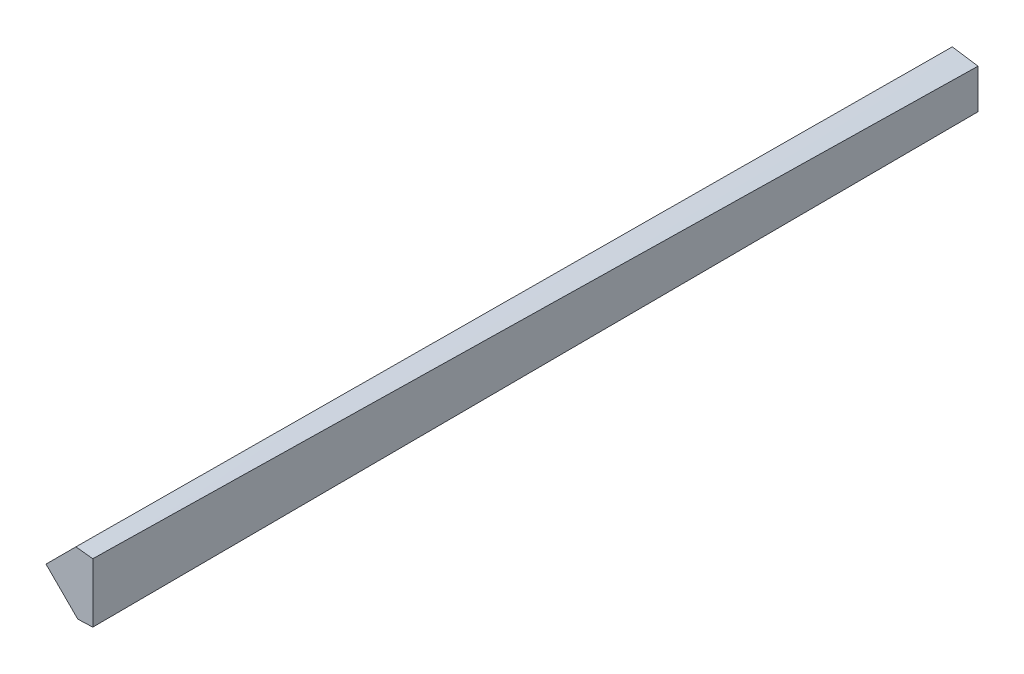
ISO-10303-21;
HEADER;
FILE_DESCRIPTION(('STEP AP214'),'2;1');
FILE_NAME('part.step','',(''),(''),'','','');
FILE_SCHEMA(('AUTOMOTIVE_DESIGN { 1 0 10303 214 1 1 1 1 }'));
ENDSEC;
DATA;
#1=APPLICATION_CONTEXT('core data for automotive mechanical design processes');
#2=APPLICATION_PROTOCOL_DEFINITION('international standard','automotive_design',2000,#1);
#3=PRODUCT_CONTEXT('',#1,'mechanical');
#4=PRODUCT('Part','Part','',(#3));
#5=PRODUCT_RELATED_PRODUCT_CATEGORY('part','',(#4));
#6=PRODUCT_DEFINITION_FORMATION('','',#4);
#7=PRODUCT_DEFINITION_CONTEXT('part definition',#1,'design');
#8=PRODUCT_DEFINITION('design','',#6,#7);
#9=PRODUCT_DEFINITION_SHAPE('','',#8);
#10=(LENGTH_UNIT() NAMED_UNIT(*) SI_UNIT(.MILLI.,.METRE.));
#11=(NAMED_UNIT(*) PLANE_ANGLE_UNIT() SI_UNIT($,.RADIAN.));
#12=(NAMED_UNIT(*) SI_UNIT($,.STERADIAN.) SOLID_ANGLE_UNIT());
#13=UNCERTAINTY_MEASURE_WITH_UNIT(LENGTH_MEASURE(1.E-05),#10,'distance_accuracy_value','');
#14=(GEOMETRIC_REPRESENTATION_CONTEXT(3) GLOBAL_UNCERTAINTY_ASSIGNED_CONTEXT((#13)) GLOBAL_UNIT_ASSIGNED_CONTEXT((#10,
#11,#12)) REPRESENTATION_CONTEXT('',''));
#15=CARTESIAN_POINT('',(0.,0.,0.));
#16=DIRECTION('',(0.,0.,1.));
#17=DIRECTION('',(1.,0.,0.));
#18=AXIS2_PLACEMENT_3D('',#15,#16,#17);
#19=CARTESIAN_POINT('',(175.085567987137,8.86155299316615,-679.45));
#20=DIRECTION('',(0.,0.,-1.));
#21=DIRECTION('',(-1.,0.,0.));
#22=AXIS2_PLACEMENT_3D('',#19,#20,#21);
#23=PLANE('',#22);
#24=DIRECTION('',(-0.707106781186546,0.707106781186549,0.));
#25=VECTOR('',#24,1.);
#26=CARTESIAN_POINT('',(143.493309988099,-2.65678052351673,-679.45));
#27=LINE('',#26,#25);
#28=CARTESIAN_POINT('',(143.493309988115,-2.65678052351616,-679.45));
#29=VERTEX_POINT('',#28);
#30=CARTESIAN_POINT('',(134.62015633349,6.21637313109208,-679.45));
#31=VERTEX_POINT('',#30);
#32=EDGE_CURVE('E295',#29,#31,#27,.T.);
#33=ORIENTED_EDGE('',*,*,#32,.T.);
#34=DIRECTION('',(0.707106781186545,0.70710678118655,0.));
#35=VECTOR('',#34,1.);
#36=CARTESIAN_POINT('',(134.62015633349,6.21637313109208,-679.45));
#37=LINE('',#36,#35);
#38=CARTESIAN_POINT('',(142.720808827515,14.3170256251169,-679.45));
#39=VERTEX_POINT('',#38);
#40=EDGE_CURVE('E165',#31,#39,#37,.T.);
#41=ORIENTED_EDGE('',*,*,#40,.T.);
#42=CARTESIAN_POINT('',(134.620156333493,15.4128451835555,-679.45));
#43=CARTESIAN_POINT('',(135.729716343512,15.2710557270873,-679.45));
#44=CARTESIAN_POINT('',(138.192823271289,14.9379110765184,-679.45));
#45=CARTESIAN_POINT('',(142.013236134128,14.4284933351529,-679.45));
#46=CARTESIAN_POINT('',(146.073742505185,13.8232141117196,-679.45));
#47=CARTESIAN_POINT('',(150.139605517909,13.2202668657995,-679.45));
#48=CARTESIAN_POINT('',(154.197683604887,12.5479467883236,-679.45));
#49=CARTESIAN_POINT('',(158.265560184403,11.9094790192579,-679.45));
#50=CARTESIAN_POINT('',(162.325264552697,11.2012187412181,-679.45));
#51=CARTESIAN_POINT('',(166.391523917957,10.4970471799216,-679.45));
#52=CARTESIAN_POINT('',(170.448647671062,9.72281472417865,-679.45));
#53=CARTESIAN_POINT('',(174.517448076692,8.98425337099883,-679.45));
#54=CARTESIAN_POINT('',(178.574031005431,8.16834190715938,-679.45));
#55=CARTESIAN_POINT('',(182.642660532388,7.3870883043623,-679.45));
#56=CARTESIAN_POINT('',(186.702108723553,6.53929151004852,-679.45));
#57=CARTESIAN_POINT('',(190.765256606112,5.68324855934698,-679.45));
#58=CARTESIAN_POINT('',(194.827790404657,4.80386244898524,-679.45));
#59=CARTESIAN_POINT('',(198.890203629623,3.90389487442927,-679.45));
#60=CARTESIAN_POINT('',(202.953557624183,2.98769437172212,-679.45));
#61=CARTESIAN_POINT('',(206.335025723878,2.1941886176228,-679.45));
#62=CARTESIAN_POINT('',(209.047708211878,1.57931571731317,-679.45));
#63=CARTESIAN_POINT('',(211.072202175627,1.07407382505783,-679.45));
#64=CARTESIAN_POINT('',(213.110075526926,0.618709231727971,-679.45));
#65=CARTESIAN_POINT('',(214.461627755124,0.287633140537885,-679.45));
#66=CARTESIAN_POINT('',(215.13815633349,0.121910771375219,-679.45));
#67=B_SPLINE_CURVE_WITH_KNOTS('',3,(#42,#43,#44,#45,#46,#47,#48,#49,#50,#51,#52,#53,#54,#55,#56,
#57,#58,#59,#60,#61,#62,#63,#64,#65,#66),.UNSPECIFIED.,.F.,.F.,(4,1,1,1,1,1,1,1,1,1,1,1,1,1,1,1,
1,1,1,1,1,1,4),(0.,0.00808012489399451,0.0179534857113933,0.0278404125043681,0.0377344781793459,
0.0476435308427544,0.0575525835061628,0.0674775651925868,0.0774108632477273,0.087361494814027,
0.0973121263803267,0.107281021733797,0.117249917087267,0.127238001400731,0.137236025479351,
0.147244218604062,0.157262809357627,0.16729202561187,0.17733209451514,0.182352128966774,
0.187383355312348,0.192403389763983,0.197434616109557),.UNSPECIFIED.);
#68=CARTESIAN_POINT('',(152.580668571194,12.8163867464822,-679.45));
#69=VERTEX_POINT('',#68);
#70=EDGE_CURVE('E207',#39,#69,#67,.T.);
#71=ORIENTED_EDGE('',*,*,#70,.T.);
#72=DIRECTION('',(0.,-1.,0.));
#73=VECTOR('',#72,1.);
#74=CARTESIAN_POINT('',(152.580668571201,12.8163867464811,-679.45));
#75=LINE('',#74,#73);
#76=CARTESIAN_POINT('',(152.580668571201,-2.33960397289713,-679.45));
#77=VERTEX_POINT('',#76);
#78=EDGE_CURVE('E90',#69,#77,#75,.T.);
#79=ORIENTED_EDGE('',*,*,#78,.T.);
#80=CARTESIAN_POINT('',(215.13784366651,-0.121910771375068,-679.45));
#81=CARTESIAN_POINT('',(214.460603955381,-0.15042090610083,-679.45));
#82=CARTESIAN_POINT('',(213.106361229738,-0.207431211204091,-679.45));
#83=CARTESIAN_POINT('',(211.073491525938,-0.251790953247334,-679.45));
#84=CARTESIAN_POINT('',(209.042065495297,-0.33902680049291,-679.45));
#85=CARTESIAN_POINT('',(206.333059407276,-0.443908014934658,-679.45));
#86=CARTESIAN_POINT('',(202.946202524654,-0.553563933266129,-679.45));
#87=CARTESIAN_POINT('',(198.881817483236,-0.683472120414775,-679.45));
#88=CARTESIAN_POINT('',(194.818916959679,-0.854412841729266,-679.45));
#89=CARTESIAN_POINT('',(190.754542770925,-0.984651069218046,-679.45));
#90=CARTESIAN_POINT('',(186.690169632013,-1.11492126417963,-679.45));
#91=CARTESIAN_POINT('',(182.627265958541,-1.28576607110368,-679.45));
#92=CARTESIAN_POINT('',(178.562892465175,-1.4160258944706,-679.45));
#93=CARTESIAN_POINT('',(174.498519694268,-1.54630560930904,-679.45));
#94=CARTESIAN_POINT('',(170.43561385315,-1.71709073436901,-679.45));
#95=CARTESIAN_POINT('',(166.371248661143,-1.84757973179484,-679.45));
#96=CARTESIAN_POINT('',(162.306844851464,-1.97700240521967,-679.45));
#97=CARTESIAN_POINT('',(158.244054877825,-2.15098690162749,-679.45));
#98=CARTESIAN_POINT('',(154.179003620324,-2.26954465119212,-679.45));
#99=CARTESIAN_POINT('',(150.116213646706,-2.44352914822967,-679.45));
#100=CARTESIAN_POINT('',(146.051809836945,-2.57295181913593,-679.45));
#101=CARTESIAN_POINT('',(141.987444645249,-2.70344082600662,-679.45));
#102=CARTESIAN_POINT('',(138.177778024242,-2.86358095260932,-679.45));
#103=CARTESIAN_POINT('',(135.721525160861,-2.9446052450096,-679.45));
#104=CARTESIAN_POINT('',(134.62015633349,-2.98009892137148,-679.45));
#105=B_SPLINE_CURVE_WITH_KNOTS('',3,(#80,#81,#82,#83,#84,#85,#86,#87,#88,#89,#90,#91,#92,#93,
#94,#95,#96,#97,#98,#99,#100,#101,#102,#103,#104),.UNSPECIFIED.,.F.,.F.,(4,1,1,1,1,1,1,1,1,1,1,
1,1,1,1,1,1,1,1,1,1,1,4),(0.806006040400567,0.810902253288598,0.815796754940576,
0.820692967828607,0.825589180716637,0.835379773174285,0.845170365631932,0.854962791407993,
0.864753383865641,0.874543976323288,0.884336402099349,0.894126994556997,0.903917587014645,
0.913710012790705,0.923500605248353,0.933291197706001,0.943083623482061,0.952874215939709,
0.96266664171577,0.972457234173417,0.982247826631065,0.992040252407126,1.),.UNSPECIFIED.);
#106=EDGE_CURVE('E13',#77,#29,#105,.T.);
#107=ORIENTED_EDGE('',*,*,#106,.T.);
#108=EDGE_LOOP('',(#33,#41,#71,#79,#107));
#109=FACE_BOUND('',#108,.T.);
#110=ADVANCED_FACE('F77',(#109),#23,.T.);
#111=CARTESIAN_POINT('',(194.174552360055,12.6206156116451,-339.598));
#112=DIRECTION('',(0.,0.,1.));
#113=DIRECTION('',(1.,0.,0.));
#114=AXIS2_PLACEMENT_3D('',#111,#112,#113);
#115=PLANE('',#114);
#116=DIRECTION('',(0.707106781186548,-0.707106781186547,0.));
#117=VECTOR('',#116,1.);
#118=CARTESIAN_POINT('',(146.823253439402,-3.99328842984262,-339.598));
#119=LINE('',#118,#117);
#120=CARTESIAN_POINT('',(134.62015633349,8.2098086760698,-339.598));
#121=VERTEX_POINT('',#120);
#122=CARTESIAN_POINT('',(146.823253439401,-3.99328842984267,-339.598));
#123=VERTEX_POINT('',#122);
#124=EDGE_CURVE('E133',#121,#123,#119,.T.);
#125=ORIENTED_EDGE('',*,*,#124,.T.);
#126=CARTESIAN_POINT('',(134.62015633349,-4.42595663658283,-339.598));
#127=CARTESIAN_POINT('',(137.849838696048,-4.30508085388316,-339.598));
#128=CARTESIAN_POINT('',(142.728131552134,-4.1684805846576,-339.598));
#129=CARTESIAN_POINT('',(149.250035994523,-3.889298345997,-339.598));
#130=CARTESIAN_POINT('',(154.191001353602,-3.72721013273353,-339.598));
#131=CARTESIAN_POINT('',(159.131965790657,-3.56509698090699,-339.598));
#132=CARTESIAN_POINT('',(164.07110969449,-3.35374269163561,-339.598));
#133=CARTESIAN_POINT('',(169.0120647307,-3.19137526907891,-339.598));
#134=CARTESIAN_POINT('',(173.953067694039,-3.03030416254037,-339.598));
#135=CARTESIAN_POINT('',(178.892067798534,-2.81506043973626,-339.598));
#136=CARTESIAN_POINT('',(183.833867842274,-2.66719729338293,-339.598));
#137=CARTESIAN_POINT('',(188.772867946794,-2.45195357134437,-339.598));
#138=CARTESIAN_POINT('',(193.713870910031,-2.29088246174404,-339.598));
#139=CARTESIAN_POINT('',(198.654825946627,-2.12851505066925,-339.598));
#140=CARTESIAN_POINT('',(203.593969849017,-1.91716071852693,-339.598));
#141=CARTESIAN_POINT('',(208.534934291454,-1.75504772667815,-339.598));
#142=CARTESIAN_POINT('',(213.475899630449,-1.59295891635564,-339.598));
#143=CARTESIAN_POINT('',(218.41504084283,-1.38153203057836,-339.598));
#144=CARTESIAN_POINT('',(223.356005741392,-1.2194306117671,-339.598));
#145=CARTESIAN_POINT('',(228.296971945599,-1.05736805505374,-339.598));
#146=CARTESIAN_POINT('',(233.236109240558,-0.845824568428618,-339.598));
#147=CARTESIAN_POINT('',(238.177088941397,-0.684163233910299,-339.598));
#148=CARTESIAN_POINT('',(242.294411906712,-0.547744685460737,-339.598));
#149=CARTESIAN_POINT('',(245.58767169763,-0.41775304433126,-339.598));
#150=CARTESIAN_POINT('',(248.057209266438,-0.309835009896686,-339.598));
#151=CARTESIAN_POINT('',(250.528541278363,-0.254040406195066,-339.598));
#152=CARTESIAN_POINT('',(252.174850508117,-0.18348941358549,-339.598));
#153=CARTESIAN_POINT('',(252.998148995216,-0.148207751775525,-339.598));
#154=B_SPLINE_CURVE_WITH_KNOTS('',3,(#126,#127,#128,#129,#130,#131,#132,#133,#134,#135,#136,
#137,#138,#139,#140,#141,#142,#143,#144,#145,#146,#147,#148,#149,#150,#151,#152,#153),
.UNSPECIFIED.,.F.,.F.,(4,1,1,1,1,1,1,1,1,1,1,1,1,1,1,1,1,1,1,1,1,1,1,1,1,4),(0.,
0.0192034583473541,0.0289958841234149,0.0387864765810626,0.0485770690387101,0.0583694948147709,
0.0681600872724186,0.0779506797300662,0.0877431055061269,0.0975336979637746,0.107326123739835,
0.117116716197483,0.126907308655131,0.136699734431191,0.146490326888839,0.156280919346487,
0.166073345122548,0.175863937580195,0.185654530037843,0.195446955813904,0.205237548271551,
0.215028140729199,0.219924353617229,0.22482056650526,0.229715068157238,0.234611281045269),.UNSPECIFIED.);
#155=CARTESIAN_POINT('',(152.580668575628,-3.78032082096611,-339.598));
#156=VERTEX_POINT('',#155);
#157=EDGE_CURVE('E175',#123,#156,#154,.T.);
#158=ORIENTED_EDGE('',*,*,#157,.T.);
#159=DIRECTION('',(0.,1.,0.));
#160=VECTOR('',#159,1.);
#161=CARTESIAN_POINT('',(152.580668575628,18.970302966159,-339.598));
#162=LINE('',#161,#160);
#163=CARTESIAN_POINT('',(152.580668575628,18.970302966159,-339.598));
#164=VERTEX_POINT('',#163);
#165=EDGE_CURVE('E250',#156,#164,#162,.T.);
#166=ORIENTED_EDGE('',*,*,#165,.T.);
#167=CARTESIAN_POINT('',(252.998226174907,0.148207751110273,-339.598));
#168=CARTESIAN_POINT('',(252.175614454486,0.34905628871512,-339.598));
#169=CARTESIAN_POINT('',(250.532220902123,0.750306579110062,-339.598));
#170=CARTESIAN_POINT('',(248.054348815467,1.30202503302794,-339.598));
#171=CARTESIAN_POINT('',(245.592696336244,1.91439188132001,-339.598));
#172=CARTESIAN_POINT('',(242.294308568737,2.65940598114388,-339.598));
#173=CARTESIAN_POINT('',(238.182710396525,3.62097107533648,-339.598));
#174=CARTESIAN_POINT('',(233.242027084944,4.73107086963747,-339.598));
#175=CARTESIAN_POINT('',(228.302502374574,5.82143706591983,-339.598));
#176=CARTESIAN_POINT('',(223.362849976669,6.88678215021274,-339.598));
#177=CARTESIAN_POINT('',(218.422472463154,7.92374826081143,-339.598));
#178=CARTESIAN_POINT('',(213.486600255424,8.95069286933694,-339.598));
#179=CARTESIAN_POINT('',(208.539627335117,9.89673211846371,-339.598));
#180=CARTESIAN_POINT('',(203.607267714716,10.884916182542,-339.598));
#181=CARTESIAN_POINT('',(198.660126249097,11.7790540678149,-339.598));
#182=CARTESIAN_POINT('',(193.727147408144,12.7165682318093,-339.598));
#183=CARTESIAN_POINT('',(188.783126670459,13.5689005872262,-339.598));
#184=CARTESIAN_POINT('',(183.847071125729,14.4262096361854,-339.598));
#185=CARTESIAN_POINT('',(178.901144649793,15.1986640387217,-339.598));
#186=CARTESIAN_POINT('',(173.967099178618,16.0122818775299,-339.598));
#187=CARTESIAN_POINT('',(169.023653216082,16.7415556296439,-339.598));
#188=CARTESIAN_POINT('',(164.086717211993,17.47366929745,-339.598));
#189=CARTESIAN_POINT('',(159.143636357812,18.1289860129173,-339.598));
#190=CARTESIAN_POINT('',(154.20811211871,18.7936793885843,-339.598));
#191=CARTESIAN_POINT('',(149.263879036725,19.3475018576684,-339.598));
#192=CARTESIAN_POINT('',(144.323994246415,19.89360071151,-339.598));
#193=CARTESIAN_POINT('',(139.446050656913,20.4252654930642,-339.598));
#194=CARTESIAN_POINT('',(136.208284585522,20.707376153436,-339.598));
#195=CARTESIAN_POINT('',(134.62015633349,20.8455739887224,-339.598));
#196=B_SPLINE_CURVE_WITH_KNOTS('',3,(#167,#168,#169,#170,#171,#172,#173,#174,#175,#176,#177,
#178,#179,#180,#181,#182,#183,#184,#185,#186,#187,#188,#189,#190,#191,#192,#193,#194,#195),
.UNSPECIFIED.,.F.,.F.,(4,1,1,1,1,1,1,1,1,1,1,1,1,1,1,1,1,1,1,1,1,1,1,1,1,1,4),
(0.761775692731026,0.7668069190766,0.771826953528235,0.776858179873809,0.781878214325443,
0.791918283228713,0.801947499482956,0.811966090236521,0.821974283361232,0.831972307439851,
0.841960391753315,0.851929287106786,0.861898182460256,0.871848814026556,0.881799445592856,
0.891732743647996,0.90165772533442,0.911566777997829,0.921475830661237,0.931369896336215,
0.94125682312919,0.951130183946588,0.960997118649047,0.97084620803462,0.980689828100494,
0.990528219086757,1.),.UNSPECIFIED.);
#197=CARTESIAN_POINT('',(146.10650302401,19.6961553665898,-339.598));
#198=VERTEX_POINT('',#197);
#199=EDGE_CURVE('E140',#164,#198,#196,.T.);
#200=ORIENTED_EDGE('',*,*,#199,.T.);
#201=DIRECTION('',(-0.707106781186547,-0.707106781186548,0.));
#202=VECTOR('',#201,1.);
#203=CARTESIAN_POINT('',(134.62015633349,8.2098086760698,-339.598));
#204=LINE('',#203,#202);
#205=EDGE_CURVE('E128',#198,#121,#204,.T.);
#206=ORIENTED_EDGE('',*,*,#205,.T.);
#207=EDGE_LOOP('',(#125,#158,#166,#200,#206));
#208=FACE_BOUND('',#207,.T.);
#209=ADVANCED_FACE('F132',(#208),#115,.T.);
#210=CARTESIAN_POINT('',(62.2081308441017,-62.2081308441013,0.364887948904961));
#211=DIRECTION('',(0.707100699218374,-0.70710069921837,0.00414756914098022));
#212=DIRECTION('',(0.707106781186545,0.70710678118655,0.));
#213=AXIS2_PLACEMENT_3D('',#210,#211,#212);
#214=PLANE('',#213);
#215=DIRECTION('',(-0.00996051883881494,-0.0158250922903294,-0.999825161975065));
#216=VECTOR('',#215,1.);
#217=CARTESIAN_POINT('',(146.10650302401,19.6961553665898,-339.598));
#218=LINE('',#217,#216);
#219=EDGE_CURVE('E167',#198,#39,#218,.T.);
#220=ORIENTED_EDGE('',*,*,#219,.T.);
#221=ORIENTED_EDGE('',*,*,#40,.F.);
#222=DIRECTION('',(0.,-0.00586549808015555,-0.999982797818178));
#223=VECTOR('',#222,1.);
#224=CARTESIAN_POINT('',(134.62015633349,8.2098086760698,-339.598));
#225=LINE('',#224,#223);
#226=EDGE_CURVE('E155',#121,#31,#225,.T.);
#227=ORIENTED_EDGE('',*,*,#226,.F.);
#228=ORIENTED_EDGE('',*,*,#205,.F.);
#229=EDGE_LOOP('',(#220,#221,#227,#228));
#230=FACE_BOUND('',#229,.T.);
#231=ADVANCED_FACE('F159',(#230),#214,.F.);
#232=CARTESIAN_POINT('',(72.4097097090649,72.4097097090647,-0.424726319502524));
#233=DIRECTION('',(0.707100699218373,0.707100699218371,-0.00414756914098059));
#234=DIRECTION('',(-0.707106781186546,0.707106781186549,0.));
#235=AXIS2_PLACEMENT_3D('',#232,#233,#234);
#236=PLANE('',#235);
#237=ORIENTED_EDGE('',*,*,#226,.T.);
#238=ORIENTED_EDGE('',*,*,#32,.F.);
#239=DIRECTION('',(-0.00979767037277226,0.00393239828494281,-0.999944269396547));
#240=VECTOR('',#239,1.);
#241=CARTESIAN_POINT('',(145.158281713758,-3.32503447667941,-509.524));
#242=LINE('',#241,#240);
#243=EDGE_CURVE('E152',#123,#29,#242,.T.);
#244=ORIENTED_EDGE('',*,*,#243,.F.);
#245=ORIENTED_EDGE('',*,*,#124,.F.);
#246=EDGE_LOOP('',(#237,#238,#244,#245));
#247=FACE_BOUND('',#246,.T.);
#248=ADVANCED_FACE('F151',(#247),#236,.F.);
#249=CARTESIAN_POINT('',(146.106503024001,19.6961553665908,-339.598));
#250=CARTESIAN_POINT('',(142.720808827515,14.3170256251169,-679.45));
#251=CARTESIAN_POINT('',(146.839750775892,19.6152585646606,-339.598));
#252=CARTESIAN_POINT('',(143.838681014523,14.156399400534,-679.45));
#253=CARTESIAN_POINT('',(147.891888602938,19.4988229278456,-339.598));
#254=CARTESIAN_POINT('',(145.441609428464,13.9175668264997,-679.45));
#255=CARTESIAN_POINT('',(149.514307301453,19.3185084379368,-339.598));
#256=CARTESIAN_POINT('',(147.913619457062,13.5503695182115,-679.45));
#257=CARTESIAN_POINT('',(150.939371386513,19.1595642464494,-339.598));
#258=CARTESIAN_POINT('',(150.084025512416,13.2217650231814,-679.45));
#259=CARTESIAN_POINT('',(152.045158410084,19.0329723546852,-339.598));
#260=CARTESIAN_POINT('',(151.765953403644,12.9489504838359,-679.45));
#261=CARTESIAN_POINT('',(152.580668575626,18.9703029661593,-339.598));
#262=CARTESIAN_POINT('',(152.580668571194,12.8163867464822,-679.45));
#263=B_SPLINE_SURFACE_WITH_KNOTS('',3,1,((#249,#250),(#251,#252),(#253,#254),(#255,#256),(#257,
#258),(#259,#260),(#261,#262)),.UNSPECIFIED.,.F.,.F.,.F.,(4,1,1,1,4),(2,2),(0.,
0.339709287157036,0.487469222815553,0.751715708532308,1.),(0.,1.),.UNSPECIFIED.);
#264=DIRECTION('',(-1.30387820103957E-11,-0.0181046678400371,-0.999836097069116));
#265=VECTOR('',#264,1.);
#266=CARTESIAN_POINT('',(152.58066857341,15.8933448563207,-509.524));
#267=LINE('',#266,#265);
#268=EDGE_CURVE('E164',#164,#69,#267,.T.);
#269=ORIENTED_EDGE('',*,*,#199,.F.);
#270=ORIENTED_EDGE('',*,*,#268,.T.);
#271=ORIENTED_EDGE('',*,*,#70,.F.);
#272=ORIENTED_EDGE('',*,*,#219,.F.);
#273=EDGE_LOOP('',(#269,#270,#271,#272));
#274=FACE_BOUND('',#273,.T.);
#275=ADVANCED_FACE('F212',(#274),#263,.T.);
#276=CARTESIAN_POINT('',(152.580668580053,2.79425104083899E-13,-1.9878969221961E-09));
#277=DIRECTION('',(-1.,0.,1.30284979132408E-11));
#278=DIRECTION('',(1.30284979132408E-11,0.,1.));
#279=AXIS2_PLACEMENT_3D('',#276,#277,#278);
#280=PLANE('',#279);
#281=DIRECTION('',(-1.30283886091837E-11,0.00423920972223876,-0.999991014510096));
#282=VECTOR('',#281,1.);
#283=CARTESIAN_POINT('',(152.580668575628,-3.78032082096611,-339.598));
#284=LINE('',#283,#282);
#285=EDGE_CURVE('E102',#156,#77,#284,.T.);
#286=ORIENTED_EDGE('',*,*,#285,.T.);
#287=ORIENTED_EDGE('',*,*,#78,.F.);
#288=ORIENTED_EDGE('',*,*,#268,.F.);
#289=ORIENTED_EDGE('',*,*,#165,.F.);
#290=EDGE_LOOP('',(#286,#287,#288,#289));
#291=FACE_BOUND('',#290,.T.);
#292=ADVANCED_FACE('F223',(#291),#280,.F.);
#293=CARTESIAN_POINT('',(152.580668575628,-3.78032082096611,-339.598));
#294=CARTESIAN_POINT('',(152.5806685712,-2.33960397289715,-679.45));
#295=CARTESIAN_POINT('',(152.05994540998,-3.79768025059691,-339.598));
#296=CARTESIAN_POINT('',(151.759018558965,-2.37202617209839,-679.45));
#297=CARTESIAN_POINT('',(150.949883748355,-3.83525783767508,-339.598));
#298=CARTESIAN_POINT('',(150.007493195801,-2.4432482006142,-679.45));
#299=CARTESIAN_POINT('',(149.570977645334,-3.88491930507124,-339.598));
#300=CARTESIAN_POINT('',(147.831035476476,-2.51629599821085,-679.45));
#301=CARTESIAN_POINT('',(148.172576414072,-3.93892725404431,-339.598));
#302=CARTESIAN_POINT('',(145.623464244673,-2.58679068750166,-679.45));
#303=CARTESIAN_POINT('',(147.363469241377,-3.97151511825709,-339.598));
#304=CARTESIAN_POINT('',(144.346103484211,-2.62773901326024,-679.45));
#305=CARTESIAN_POINT('',(146.823253439401,-3.99328842984268,-339.598));
#306=CARTESIAN_POINT('',(143.493309988116,-2.65678052351615,-679.45));
#307=B_SPLINE_SURFACE_WITH_KNOTS('',3,1,((#293,#294),(#295,#296),(#297,#298),(#299,#300),(#301,
#302),(#303,#304),(#305,#306)),.UNSPECIFIED.,.F.,.F.,.F.,(4,1,1,1,4),(2,2),(0.,
0.271295149902648,0.578349664226711,0.718476832542511,1.),(0.,1.),.UNSPECIFIED.);
#308=ORIENTED_EDGE('',*,*,#157,.F.);
#309=ORIENTED_EDGE('',*,*,#243,.T.);
#310=ORIENTED_EDGE('',*,*,#106,.F.);
#311=ORIENTED_EDGE('',*,*,#285,.F.);
#312=EDGE_LOOP('',(#308,#309,#310,#311));
#313=FACE_BOUND('',#312,.T.);
#314=ADVANCED_FACE('F261',(#313),#307,.T.);
#315=CLOSED_SHELL('',(#110,#209,#231,#248,#275,#292,#314));
#316=MANIFOLD_SOLID_BREP('B2',#315);
#317=ADVANCED_BREP_SHAPE_REPRESENTATION('',(#18,#316),#14);
#318=SHAPE_DEFINITION_REPRESENTATION(#9,#317);
ENDSEC;
END-ISO-10303-21;
